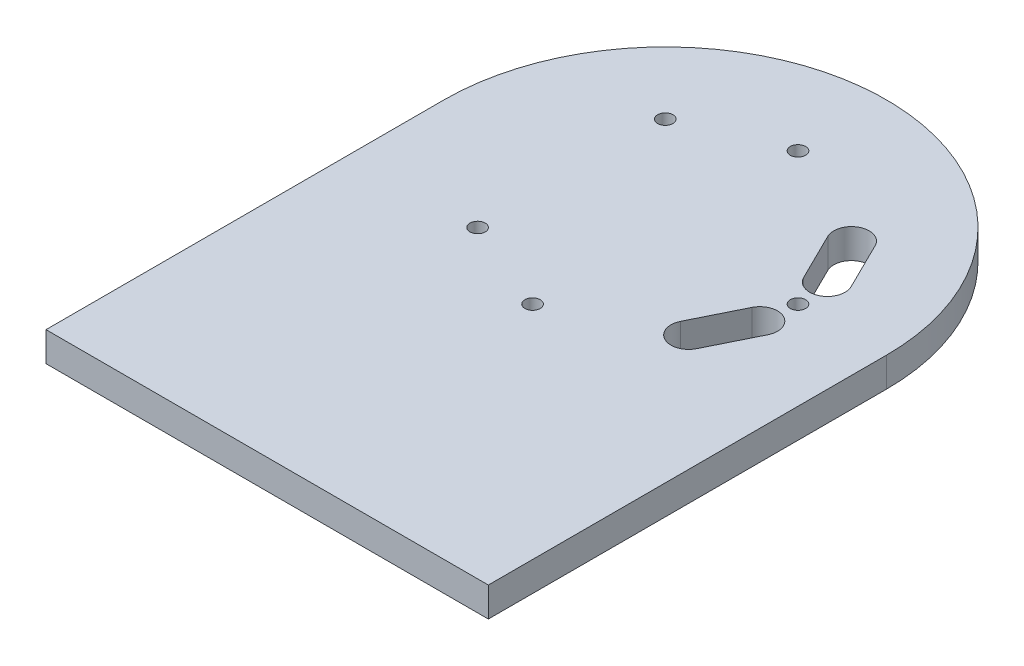
ISO-10303-21;
HEADER;
FILE_DESCRIPTION(('STEP AP214'),'2;1');
FILE_NAME('part.step','',(''),(''),'','','');
FILE_SCHEMA(('AUTOMOTIVE_DESIGN { 1 0 10303 214 1 1 1 1 }'));
ENDSEC;
DATA;
#1=APPLICATION_CONTEXT('core data for automotive mechanical design processes');
#2=APPLICATION_PROTOCOL_DEFINITION('international standard','automotive_design',2000,#1);
#3=PRODUCT_CONTEXT('',#1,'mechanical');
#4=PRODUCT('Part','Part','',(#3));
#5=PRODUCT_RELATED_PRODUCT_CATEGORY('part','',(#4));
#6=PRODUCT_DEFINITION_FORMATION('','',#4);
#7=PRODUCT_DEFINITION_CONTEXT('part definition',#1,'design');
#8=PRODUCT_DEFINITION('design','',#6,#7);
#9=PRODUCT_DEFINITION_SHAPE('','',#8);
#10=(LENGTH_UNIT() NAMED_UNIT(*) SI_UNIT(.MILLI.,.METRE.));
#11=(NAMED_UNIT(*) PLANE_ANGLE_UNIT() SI_UNIT($,.RADIAN.));
#12=(NAMED_UNIT(*) SI_UNIT($,.STERADIAN.) SOLID_ANGLE_UNIT());
#13=UNCERTAINTY_MEASURE_WITH_UNIT(LENGTH_MEASURE(1.E-05),#10,'distance_accuracy_value','');
#14=(GEOMETRIC_REPRESENTATION_CONTEXT(3) GLOBAL_UNCERTAINTY_ASSIGNED_CONTEXT((#13)) GLOBAL_UNIT_ASSIGNED_CONTEXT((#10,
#11,#12)) REPRESENTATION_CONTEXT('',''));
#15=CARTESIAN_POINT('',(0.,0.,0.));
#16=DIRECTION('',(0.,0.,1.));
#17=DIRECTION('',(1.,0.,0.));
#18=AXIS2_PLACEMENT_3D('',#15,#16,#17);
#19=CARTESIAN_POINT('',(-4.0862049089915,6.35,80.0777913457547));
#20=DIRECTION('',(0.896542211805716,0.,0.442958307801664));
#21=DIRECTION('',(0.442958307801664,0.,-0.896542211805716));
#22=AXIS2_PLACEMENT_3D('',#19,#20,#21);
#23=PLANE('',#22);
#24=DIRECTION('',(-0.442958307801664,0.,0.896542211805716));
#25=VECTOR('',#24,1.);
#26=CARTESIAN_POINT('',(-4.0862049089915,0.,80.0777913457547));
#27=LINE('',#26,#25);
#28=CARTESIAN_POINT('',(31.0484235350287,0.,8.96573194562274));
#29=VERTEX_POINT('',#28);
#30=CARTESIAN_POINT('',(25.9854100768557,0.,19.2132094265621));
#31=VERTEX_POINT('',#30);
#32=EDGE_CURVE('E186',#29,#31,#27,.T.);
#33=ORIENTED_EDGE('',*,*,#32,.T.);
#34=DIRECTION('',(0.,-1.,0.));
#35=VECTOR('',#34,1.);
#36=CARTESIAN_POINT('',(25.9854100768557,6.35,19.2132094265621));
#37=LINE('',#36,#35);
#38=CARTESIAN_POINT('',(25.9854100768557,6.35,19.2132094265621));
#39=VERTEX_POINT('',#38);
#40=EDGE_CURVE('E11',#39,#31,#37,.T.);
#41=ORIENTED_EDGE('',*,*,#40,.F.);
#42=DIRECTION('',(-0.442958307801664,0.,0.896542211805716));
#43=VECTOR('',#42,1.);
#44=CARTESIAN_POINT('',(-4.0862049089915,6.35,80.0777913457547));
#45=LINE('',#44,#43);
#46=CARTESIAN_POINT('',(31.0484235350287,6.35,8.96573194562274));
#47=VERTEX_POINT('',#46);
#48=EDGE_CURVE('E133',#47,#39,#45,.T.);
#49=ORIENTED_EDGE('',*,*,#48,.F.);
#50=DIRECTION('',(0.,-1.,0.));
#51=VECTOR('',#50,1.);
#52=CARTESIAN_POINT('',(31.0484235350287,6.35,8.96573194562274));
#53=LINE('',#52,#51);
#54=EDGE_CURVE('E194',#47,#29,#53,.T.);
#55=ORIENTED_EDGE('',*,*,#54,.T.);
#56=EDGE_LOOP('',(#33,#41,#49,#55));
#57=FACE_BOUND('',#56,.T.);
#58=ADVANCED_FACE('F31',(#57),#23,.F.);
#59=CARTESIAN_POINT('',(22.5695842498759,6.35,17.5255382738377));
#60=DIRECTION('',(0.,-1.,0.));
#61=DIRECTION('',(0.,0.,-1.));
#62=AXIS2_PLACEMENT_3D('',#59,#60,#61);
#63=CYLINDRICAL_SURFACE('',#62,3.81);
#64=CARTESIAN_POINT('',(22.5695842498759,0.,17.5255382738377));
#65=DIRECTION('',(0.,1.,0.));
#66=DIRECTION('',(0.,0.,1.));
#67=AXIS2_PLACEMENT_3D('',#64,#65,#66);
#68=CIRCLE('',#67,3.81);
#69=CARTESIAN_POINT('',(19.1537584228962,0.,15.8378671211134));
#70=VERTEX_POINT('',#69);
#71=EDGE_CURVE('E139',#31,#70,#68,.F.);
#72=ORIENTED_EDGE('',*,*,#71,.T.);
#73=DIRECTION('',(0.,-1.,0.));
#74=VECTOR('',#73,1.);
#75=CARTESIAN_POINT('',(19.1537584228962,6.35,15.8378671211134));
#76=LINE('',#75,#74);
#77=CARTESIAN_POINT('',(19.1537584228962,6.35,15.8378671211134));
#78=VERTEX_POINT('',#77);
#79=EDGE_CURVE('E41',#78,#70,#76,.T.);
#80=ORIENTED_EDGE('',*,*,#79,.F.);
#81=CARTESIAN_POINT('',(22.5695842498759,6.35,17.5255382738377));
#82=DIRECTION('',(0.,1.,0.));
#83=DIRECTION('',(0.,0.,1.));
#84=AXIS2_PLACEMENT_3D('',#81,#82,#83);
#85=CIRCLE('',#84,3.81);
#86=EDGE_CURVE('E127',#39,#78,#85,.F.);
#87=ORIENTED_EDGE('',*,*,#86,.F.);
#88=ORIENTED_EDGE('',*,*,#40,.T.);
#89=EDGE_LOOP('',(#72,#80,#87,#88));
#90=FACE_BOUND('',#89,.T.);
#91=ADVANCED_FACE('F138',(#90),#63,.F.);
#92=CARTESIAN_POINT('',(-10.9178565629511,6.35,76.7024490403061));
#93=DIRECTION('',(0.896542211805716,0.,0.442958307801665));
#94=DIRECTION('',(0.442958307801665,0.,-0.896542211805716));
#95=AXIS2_PLACEMENT_3D('',#92,#93,#94);
#96=PLANE('',#95);
#97=DIRECTION('',(-0.442958307801665,0.,0.896542211805716));
#98=VECTOR('',#97,1.);
#99=CARTESIAN_POINT('',(-10.9178565629511,0.,76.7024490403061));
#100=LINE('',#99,#98);
#101=CARTESIAN_POINT('',(24.2167718810692,0.,5.59038964017405));
#102=VERTEX_POINT('',#101);
#103=EDGE_CURVE('E190',#102,#70,#100,.T.);
#104=ORIENTED_EDGE('',*,*,#103,.F.);
#105=DIRECTION('',(0.,-1.,0.));
#106=VECTOR('',#105,1.);
#107=CARTESIAN_POINT('',(24.2167718810692,6.35,5.59038964017405));
#108=LINE('',#107,#106);
#109=CARTESIAN_POINT('',(24.2167718810692,6.35,5.59038964017405));
#110=VERTEX_POINT('',#109);
#111=EDGE_CURVE('E90',#110,#102,#108,.T.);
#112=ORIENTED_EDGE('',*,*,#111,.F.);
#113=DIRECTION('',(-0.442958307801665,0.,0.896542211805716));
#114=VECTOR('',#113,1.);
#115=CARTESIAN_POINT('',(-10.9178565629511,6.35,76.7024490403061));
#116=LINE('',#115,#114);
#117=EDGE_CURVE('E131',#110,#78,#116,.T.);
#118=ORIENTED_EDGE('',*,*,#117,.T.);
#119=ORIENTED_EDGE('',*,*,#79,.T.);
#120=EDGE_LOOP('',(#104,#112,#118,#119));
#121=FACE_BOUND('',#120,.T.);
#122=ADVANCED_FACE('F144',(#121),#96,.T.);
#123=CARTESIAN_POINT('',(22.569584249876,6.35,-17.5255382738377));
#124=DIRECTION('',(0.,-1.,0.));
#125=DIRECTION('',(0.,0.,-1.));
#126=AXIS2_PLACEMENT_3D('',#123,#124,#125);
#127=CYLINDRICAL_SURFACE('',#126,3.81);
#128=CARTESIAN_POINT('',(22.569584249876,0.,-17.5255382738377));
#129=DIRECTION('',(0.,1.,0.));
#130=DIRECTION('',(0.,0.,1.));
#131=AXIS2_PLACEMENT_3D('',#128,#129,#130);
#132=CIRCLE('',#131,3.81);
#133=CARTESIAN_POINT('',(25.9854100768557,0.,-19.2132094265621));
#134=VERTEX_POINT('',#133);
#135=CARTESIAN_POINT('',(19.1537584228962,0.,-15.8378671211134));
#136=VERTEX_POINT('',#135);
#137=EDGE_CURVE('E174',#134,#136,#132,.T.);
#138=ORIENTED_EDGE('',*,*,#137,.F.);
#139=DIRECTION('',(0.,-1.,0.));
#140=VECTOR('',#139,1.);
#141=CARTESIAN_POINT('',(25.9854100768557,6.35,-19.2132094265621));
#142=LINE('',#141,#140);
#143=CARTESIAN_POINT('',(25.9854100768557,6.35,-19.2132094265621));
#144=VERTEX_POINT('',#143);
#145=EDGE_CURVE('E196',#144,#134,#142,.T.);
#146=ORIENTED_EDGE('',*,*,#145,.F.);
#147=CARTESIAN_POINT('',(22.569584249876,6.35,-17.5255382738377));
#148=DIRECTION('',(0.,1.,0.));
#149=DIRECTION('',(0.,0.,1.));
#150=AXIS2_PLACEMENT_3D('',#147,#148,#149);
#151=CIRCLE('',#150,3.81);
#152=CARTESIAN_POINT('',(19.1537584228962,6.35,-15.8378671211134));
#153=VERTEX_POINT('',#152);
#154=EDGE_CURVE('E251',#144,#153,#151,.T.);
#155=ORIENTED_EDGE('',*,*,#154,.T.);
#156=DIRECTION('',(0.,-1.,0.));
#157=VECTOR('',#156,1.);
#158=CARTESIAN_POINT('',(19.1537584228962,6.35,-15.8378671211134));
#159=LINE('',#158,#157);
#160=EDGE_CURVE('E198',#153,#136,#159,.T.);
#161=ORIENTED_EDGE('',*,*,#160,.T.);
#162=EDGE_LOOP('',(#138,#146,#155,#161));
#163=FACE_BOUND('',#162,.T.);
#164=ADVANCED_FACE('F272',(#163),#127,.F.);
#165=CARTESIAN_POINT('',(11.0444793716504,6.35,-49.4534709251194));
#166=DIRECTION('',(-0.896542211805716,0.,0.442958307801664));
#167=DIRECTION('',(0.442958307801664,0.,0.896542211805716));
#168=AXIS2_PLACEMENT_3D('',#165,#166,#167);
#169=PLANE('',#168);
#170=DIRECTION('',(-0.442958307801664,0.,-0.896542211805716));
#171=VECTOR('',#170,1.);
#172=CARTESIAN_POINT('',(11.0444793716504,0.,-49.4534709251194));
#173=LINE('',#172,#171);
#174=CARTESIAN_POINT('',(31.0484235350288,0.,-8.96573194562273));
#175=VERTEX_POINT('',#174);
#176=EDGE_CURVE('E177',#175,#134,#173,.T.);
#177=ORIENTED_EDGE('',*,*,#176,.F.);
#178=DIRECTION('',(0.,-1.,0.));
#179=VECTOR('',#178,1.);
#180=CARTESIAN_POINT('',(31.0484235350288,6.35,-8.96573194562273));
#181=LINE('',#180,#179);
#182=CARTESIAN_POINT('',(31.0484235350288,6.35,-8.96573194562273));
#183=VERTEX_POINT('',#182);
#184=EDGE_CURVE('E202',#183,#175,#181,.T.);
#185=ORIENTED_EDGE('',*,*,#184,.F.);
#186=DIRECTION('',(-0.442958307801664,0.,-0.896542211805716));
#187=VECTOR('',#186,1.);
#188=CARTESIAN_POINT('',(11.0444793716504,6.35,-49.4534709251194));
#189=LINE('',#188,#187);
#190=EDGE_CURVE('E254',#183,#144,#189,.T.);
#191=ORIENTED_EDGE('',*,*,#190,.T.);
#192=ORIENTED_EDGE('',*,*,#145,.T.);
#193=EDGE_LOOP('',(#177,#185,#191,#192));
#194=FACE_BOUND('',#193,.T.);
#195=ADVANCED_FACE('F275',(#194),#169,.T.);
#196=CARTESIAN_POINT('',(27.632597708049,6.35,-7.27806079289839));
#197=DIRECTION('',(0.,-1.,0.));
#198=DIRECTION('',(0.,0.,-1.));
#199=AXIS2_PLACEMENT_3D('',#196,#197,#198);
#200=CYLINDRICAL_SURFACE('',#199,3.81);
#201=CARTESIAN_POINT('',(27.632597708049,0.,-7.27806079289839));
#202=DIRECTION('',(0.,1.,0.));
#203=DIRECTION('',(0.,0.,1.));
#204=AXIS2_PLACEMENT_3D('',#201,#202,#203);
#205=CIRCLE('',#204,3.81);
#206=CARTESIAN_POINT('',(24.2167718810693,0.,-5.59038964017405));
#207=VERTEX_POINT('',#206);
#208=EDGE_CURVE('E180',#207,#175,#205,.T.);
#209=ORIENTED_EDGE('',*,*,#208,.F.);
#210=DIRECTION('',(0.,-1.,0.));
#211=VECTOR('',#210,1.);
#212=CARTESIAN_POINT('',(24.2167718810693,6.35,-5.59038964017405));
#213=LINE('',#212,#211);
#214=CARTESIAN_POINT('',(24.2167718810693,6.35,-5.59038964017405));
#215=VERTEX_POINT('',#214);
#216=EDGE_CURVE('E200',#215,#207,#213,.T.);
#217=ORIENTED_EDGE('',*,*,#216,.F.);
#218=CARTESIAN_POINT('',(27.632597708049,6.35,-7.27806079289839));
#219=DIRECTION('',(0.,1.,0.));
#220=DIRECTION('',(0.,0.,1.));
#221=AXIS2_PLACEMENT_3D('',#218,#219,#220);
#222=CIRCLE('',#221,3.81);
#223=EDGE_CURVE('E257',#215,#183,#222,.T.);
#224=ORIENTED_EDGE('',*,*,#223,.T.);
#225=ORIENTED_EDGE('',*,*,#184,.T.);
#226=EDGE_LOOP('',(#209,#217,#224,#225));
#227=FACE_BOUND('',#226,.T.);
#228=ADVANCED_FACE('F278',(#227),#200,.F.);
#229=CARTESIAN_POINT('',(-47.625,6.35,19.05));
#230=DIRECTION('',(1.,0.,0.));
#231=DIRECTION('',(0.,0.,-1.));
#232=AXIS2_PLACEMENT_3D('',#229,#230,#231);
#233=PLANE('',#232);
#234=DIRECTION('',(0.,0.,1.));
#235=VECTOR('',#234,1.);
#236=CARTESIAN_POINT('',(-47.625,0.,19.05));
#237=LINE('',#236,#235);
#238=CARTESIAN_POINT('',(-47.625,0.,0.));
#239=VERTEX_POINT('',#238);
#240=CARTESIAN_POINT('',(-47.625,0.,85.725));
#241=VERTEX_POINT('',#240);
#242=EDGE_CURVE('E150',#239,#241,#237,.T.);
#243=ORIENTED_EDGE('',*,*,#242,.T.);
#244=DIRECTION('',(0.,-1.,0.));
#245=VECTOR('',#244,1.);
#246=CARTESIAN_POINT('',(-47.625,6.35,85.725));
#247=LINE('',#246,#245);
#248=CARTESIAN_POINT('',(-47.625,6.35,85.725));
#249=VERTEX_POINT('',#248);
#250=EDGE_CURVE('E35',#249,#241,#247,.T.);
#251=ORIENTED_EDGE('',*,*,#250,.F.);
#252=DIRECTION('',(0.,0.,1.));
#253=VECTOR('',#252,1.);
#254=CARTESIAN_POINT('',(-47.625,6.35,19.05));
#255=LINE('',#254,#253);
#256=CARTESIAN_POINT('',(-47.625,6.35,0.));
#257=VERTEX_POINT('',#256);
#258=EDGE_CURVE('E193',#257,#249,#255,.T.);
#259=ORIENTED_EDGE('',*,*,#258,.F.);
#260=DIRECTION('',(0.,-1.,0.));
#261=VECTOR('',#260,1.);
#262=CARTESIAN_POINT('',(-47.625,6.35,0.));
#263=LINE('',#262,#261);
#264=EDGE_CURVE('E146',#257,#239,#263,.T.);
#265=ORIENTED_EDGE('',*,*,#264,.T.);
#266=EDGE_LOOP('',(#243,#251,#259,#265));
#267=FACE_BOUND('',#266,.T.);
#268=ADVANCED_FACE('F33',(#267),#233,.F.);
#269=CARTESIAN_POINT('',(-127.605710178636,6.35,85.725));
#270=DIRECTION('',(0.,0.,-1.));
#271=DIRECTION('',(-1.,0.,0.));
#272=AXIS2_PLACEMENT_3D('',#269,#270,#271);
#273=PLANE('',#272);
#274=DIRECTION('',(1.,0.,0.));
#275=VECTOR('',#274,1.);
#276=CARTESIAN_POINT('',(-127.605710178636,0.,85.725));
#277=LINE('',#276,#275);
#278=CARTESIAN_POINT('',(47.625,0.,85.725));
#279=VERTEX_POINT('',#278);
#280=EDGE_CURVE('E153',#241,#279,#277,.T.);
#281=ORIENTED_EDGE('',*,*,#280,.T.);
#282=DIRECTION('',(0.,-1.,0.));
#283=VECTOR('',#282,1.);
#284=CARTESIAN_POINT('',(47.625,6.35,85.725));
#285=LINE('',#284,#283);
#286=CARTESIAN_POINT('',(47.625,6.35,85.725));
#287=VERTEX_POINT('',#286);
#288=EDGE_CURVE('E209',#287,#279,#285,.T.);
#289=ORIENTED_EDGE('',*,*,#288,.F.);
#290=DIRECTION('',(1.,0.,0.));
#291=VECTOR('',#290,1.);
#292=CARTESIAN_POINT('',(-127.605710178636,6.35,85.725));
#293=LINE('',#292,#291);
#294=EDGE_CURVE('E102',#249,#287,#293,.T.);
#295=ORIENTED_EDGE('',*,*,#294,.F.);
#296=ORIENTED_EDGE('',*,*,#250,.T.);
#297=EDGE_LOOP('',(#281,#289,#295,#296));
#298=FACE_BOUND('',#297,.T.);
#299=ADVANCED_FACE('F215',(#298),#273,.F.);
#300=CARTESIAN_POINT('',(47.625,6.35,19.05));
#301=DIRECTION('',(-1.,0.,0.));
#302=DIRECTION('',(0.,0.,1.));
#303=AXIS2_PLACEMENT_3D('',#300,#301,#302);
#304=PLANE('',#303);
#305=DIRECTION('',(0.,0.,-1.));
#306=VECTOR('',#305,1.);
#307=CARTESIAN_POINT('',(47.625,0.,19.05));
#308=LINE('',#307,#306);
#309=CARTESIAN_POINT('',(47.625,0.,0.));
#310=VERTEX_POINT('',#309);
#311=EDGE_CURVE('E155',#279,#310,#308,.T.);
#312=ORIENTED_EDGE('',*,*,#311,.T.);
#313=DIRECTION('',(0.,-1.,0.));
#314=VECTOR('',#313,1.);
#315=CARTESIAN_POINT('',(47.625,6.35,0.));
#316=LINE('',#315,#314);
#317=CARTESIAN_POINT('',(47.625,6.35,0.));
#318=VERTEX_POINT('',#317);
#319=EDGE_CURVE('E207',#318,#310,#316,.T.);
#320=ORIENTED_EDGE('',*,*,#319,.F.);
#321=DIRECTION('',(0.,0.,-1.));
#322=VECTOR('',#321,1.);
#323=CARTESIAN_POINT('',(47.625,6.35,19.05));
#324=LINE('',#323,#322);
#325=EDGE_CURVE('E232',#287,#318,#324,.T.);
#326=ORIENTED_EDGE('',*,*,#325,.F.);
#327=ORIENTED_EDGE('',*,*,#288,.T.);
#328=EDGE_LOOP('',(#312,#320,#326,#327));
#329=FACE_BOUND('',#328,.T.);
#330=ADVANCED_FACE('F225',(#329),#304,.F.);
#331=CARTESIAN_POINT('',(4.21282771769083,6.35,-46.0781286196707));
#332=DIRECTION('',(-0.896542211805716,0.,0.442958307801665));
#333=DIRECTION('',(0.442958307801665,0.,0.896542211805716));
#334=AXIS2_PLACEMENT_3D('',#331,#332,#333);
#335=PLANE('',#334);
#336=DIRECTION('',(-0.442958307801665,0.,-0.896542211805716));
#337=VECTOR('',#336,1.);
#338=CARTESIAN_POINT('',(4.21282771769083,0.,-46.0781286196707));
#339=LINE('',#338,#337);
#340=EDGE_CURVE('E183',#207,#136,#339,.T.);
#341=ORIENTED_EDGE('',*,*,#340,.T.);
#342=ORIENTED_EDGE('',*,*,#160,.F.);
#343=DIRECTION('',(-0.442958307801665,0.,-0.896542211805716));
#344=VECTOR('',#343,1.);
#345=CARTESIAN_POINT('',(4.21282771769083,6.35,-46.0781286196707));
#346=LINE('',#345,#344);
#347=EDGE_CURVE('E260',#215,#153,#346,.T.);
#348=ORIENTED_EDGE('',*,*,#347,.F.);
#349=ORIENTED_EDGE('',*,*,#216,.T.);
#350=EDGE_LOOP('',(#341,#342,#348,#349));
#351=FACE_BOUND('',#350,.T.);
#352=ADVANCED_FACE('F268',(#351),#335,.F.);
#353=CARTESIAN_POINT('',(-20.2055762724057,6.35,20.2055762724055));
#354=DIRECTION('',(0.,-1.,0.));
#355=DIRECTION('',(0.,0.,-1.));
#356=AXIS2_PLACEMENT_3D('',#353,#354,#355);
#357=CYLINDRICAL_SURFACE('',#356,1.651);
#358=CARTESIAN_POINT('',(-20.2055762724057,6.35,20.2055762724055));
#359=DIRECTION('',(0.,1.,0.));
#360=DIRECTION('',(0.,0.,1.));
#361=AXIS2_PLACEMENT_3D('',#358,#359,#360);
#362=CIRCLE('',#361,1.651);
#363=CARTESIAN_POINT('',(-20.2055762724057,6.35,21.8565762724055));
#364=VERTEX_POINT('',#363);
#365=EDGE_CURVE('E248',#364,#364,#362,.T.);
#366=ORIENTED_EDGE('',*,*,#365,.T.);
#367=EDGE_LOOP('',(#366));
#368=FACE_BOUND('',#367,.T.);
#369=CARTESIAN_POINT('',(-20.2055762724057,0.,20.2055762724055));
#370=DIRECTION('',(0.,1.,0.));
#371=DIRECTION('',(0.,0.,1.));
#372=AXIS2_PLACEMENT_3D('',#369,#370,#371);
#373=CIRCLE('',#372,1.651);
#374=CARTESIAN_POINT('',(-20.2055762724057,0.,21.8565762724055));
#375=VERTEX_POINT('',#374);
#376=EDGE_CURVE('E171',#375,#375,#373,.T.);
#377=ORIENTED_EDGE('',*,*,#376,.F.);
#378=EDGE_LOOP('',(#377));
#379=FACE_BOUND('',#378,.T.);
#380=ADVANCED_FACE('F305',(#368,#379),#357,.F.);
#381=CARTESIAN_POINT('',(-20.2055762724057,6.35,-20.2055762724055));
#382=DIRECTION('',(0.,-1.,0.));
#383=DIRECTION('',(0.,0.,-1.));
#384=AXIS2_PLACEMENT_3D('',#381,#382,#383);
#385=CYLINDRICAL_SURFACE('',#384,1.651);
#386=CARTESIAN_POINT('',(-20.2055762724057,6.35,-20.2055762724055));
#387=DIRECTION('',(0.,1.,0.));
#388=DIRECTION('',(0.,0.,1.));
#389=AXIS2_PLACEMENT_3D('',#386,#387,#388);
#390=CIRCLE('',#389,1.651);
#391=CARTESIAN_POINT('',(-20.2055762724057,6.35,-18.5545762724055));
#392=VERTEX_POINT('',#391);
#393=EDGE_CURVE('E245',#392,#392,#390,.T.);
#394=ORIENTED_EDGE('',*,*,#393,.T.);
#395=EDGE_LOOP('',(#394));
#396=FACE_BOUND('',#395,.T.);
#397=CARTESIAN_POINT('',(-20.2055762724057,0.,-20.2055762724055));
#398=DIRECTION('',(0.,1.,0.));
#399=DIRECTION('',(0.,0.,1.));
#400=AXIS2_PLACEMENT_3D('',#397,#398,#399);
#401=CIRCLE('',#400,1.651);
#402=CARTESIAN_POINT('',(-20.2055762724057,0.,-18.5545762724055));
#403=VERTEX_POINT('',#402);
#404=EDGE_CURVE('E168',#403,#403,#401,.T.);
#405=ORIENTED_EDGE('',*,*,#404,.F.);
#406=EDGE_LOOP('',(#405));
#407=FACE_BOUND('',#406,.T.);
#408=ADVANCED_FACE('F314',(#396,#407),#385,.F.);
#409=CARTESIAN_POINT('',(28.575,6.35,0.));
#410=DIRECTION('',(0.,-1.,0.));
#411=DIRECTION('',(0.,0.,-1.));
#412=AXIS2_PLACEMENT_3D('',#409,#410,#411);
#413=CYLINDRICAL_SURFACE('',#412,1.651);
#414=CARTESIAN_POINT('',(28.575,6.35,0.));
#415=DIRECTION('',(0.,1.,0.));
#416=DIRECTION('',(0.,0.,1.));
#417=AXIS2_PLACEMENT_3D('',#414,#415,#416);
#418=CIRCLE('',#417,1.651);
#419=CARTESIAN_POINT('',(28.575,6.35,1.651));
#420=VERTEX_POINT('',#419);
#421=EDGE_CURVE('E242',#420,#420,#418,.T.);
#422=ORIENTED_EDGE('',*,*,#421,.T.);
#423=EDGE_LOOP('',(#422));
#424=FACE_BOUND('',#423,.T.);
#425=CARTESIAN_POINT('',(28.575,0.,0.));
#426=DIRECTION('',(0.,1.,0.));
#427=DIRECTION('',(0.,0.,1.));
#428=AXIS2_PLACEMENT_3D('',#425,#426,#427);
#429=CIRCLE('',#428,1.651);
#430=CARTESIAN_POINT('',(28.575,0.,1.651));
#431=VERTEX_POINT('',#430);
#432=EDGE_CURVE('E165',#431,#431,#429,.T.);
#433=ORIENTED_EDGE('',*,*,#432,.F.);
#434=EDGE_LOOP('',(#433));
#435=FACE_BOUND('',#434,.T.);
#436=ADVANCED_FACE('F318',(#424,#435),#413,.F.);
#437=CARTESIAN_POINT('',(0.,6.35,28.575));
#438=DIRECTION('',(0.,-1.,0.));
#439=DIRECTION('',(0.,0.,-1.));
#440=AXIS2_PLACEMENT_3D('',#437,#438,#439);
#441=CYLINDRICAL_SURFACE('',#440,1.651);
#442=CARTESIAN_POINT('',(0.,6.35,28.575));
#443=DIRECTION('',(0.,1.,0.));
#444=DIRECTION('',(0.,0.,1.));
#445=AXIS2_PLACEMENT_3D('',#442,#443,#444);
#446=CIRCLE('',#445,1.651);
#447=CARTESIAN_POINT('',(0.,6.35,30.226));
#448=VERTEX_POINT('',#447);
#449=EDGE_CURVE('E235',#448,#448,#446,.T.);
#450=ORIENTED_EDGE('',*,*,#449,.T.);
#451=EDGE_LOOP('',(#450));
#452=FACE_BOUND('',#451,.T.);
#453=CARTESIAN_POINT('',(0.,0.,28.575));
#454=DIRECTION('',(0.,1.,0.));
#455=DIRECTION('',(0.,0.,1.));
#456=AXIS2_PLACEMENT_3D('',#453,#454,#455);
#457=CIRCLE('',#456,1.651);
#458=CARTESIAN_POINT('',(0.,0.,30.226));
#459=VERTEX_POINT('',#458);
#460=EDGE_CURVE('E162',#459,#459,#457,.T.);
#461=ORIENTED_EDGE('',*,*,#460,.F.);
#462=EDGE_LOOP('',(#461));
#463=FACE_BOUND('',#462,.T.);
#464=ADVANCED_FACE('F322',(#452,#463),#441,.F.);
#465=CARTESIAN_POINT('',(0.,6.35,-28.575));
#466=DIRECTION('',(0.,-1.,0.));
#467=DIRECTION('',(0.,0.,-1.));
#468=AXIS2_PLACEMENT_3D('',#465,#466,#467);
#469=CYLINDRICAL_SURFACE('',#468,1.651);
#470=CARTESIAN_POINT('',(0.,6.35,-28.575));
#471=DIRECTION('',(0.,1.,0.));
#472=DIRECTION('',(0.,0.,1.));
#473=AXIS2_PLACEMENT_3D('',#470,#471,#472);
#474=CIRCLE('',#473,1.651);
#475=CARTESIAN_POINT('',(0.,6.35,-26.924));
#476=VERTEX_POINT('',#475);
#477=EDGE_CURVE('E231',#476,#476,#474,.T.);
#478=ORIENTED_EDGE('',*,*,#477,.T.);
#479=EDGE_LOOP('',(#478));
#480=FACE_BOUND('',#479,.T.);
#481=CARTESIAN_POINT('',(0.,0.,-28.575));
#482=DIRECTION('',(0.,1.,0.));
#483=DIRECTION('',(0.,0.,1.));
#484=AXIS2_PLACEMENT_3D('',#481,#482,#483);
#485=CIRCLE('',#484,1.651);
#486=CARTESIAN_POINT('',(0.,0.,-26.924));
#487=VERTEX_POINT('',#486);
#488=EDGE_CURVE('E159',#487,#487,#485,.T.);
#489=ORIENTED_EDGE('',*,*,#488,.F.);
#490=EDGE_LOOP('',(#489));
#491=FACE_BOUND('',#490,.T.);
#492=ADVANCED_FACE('F293',(#480,#491),#469,.F.);
#493=CARTESIAN_POINT('',(0.,6.35,0.));
#494=DIRECTION('',(0.,-1.,0.));
#495=DIRECTION('',(0.,0.,-1.));
#496=AXIS2_PLACEMENT_3D('',#493,#494,#495);
#497=CYLINDRICAL_SURFACE('',#496,47.625);
#498=CARTESIAN_POINT('',(0.,0.,0.));
#499=DIRECTION('',(0.,1.,0.));
#500=DIRECTION('',(0.,0.,1.));
#501=AXIS2_PLACEMENT_3D('',#498,#499,#500);
#502=CIRCLE('',#501,47.625);
#503=EDGE_CURVE('E157',#310,#239,#502,.T.);
#504=ORIENTED_EDGE('',*,*,#503,.T.);
#505=ORIENTED_EDGE('',*,*,#264,.F.);
#506=CARTESIAN_POINT('',(0.,6.35,0.));
#507=DIRECTION('',(0.,1.,0.));
#508=DIRECTION('',(0.,0.,1.));
#509=AXIS2_PLACEMENT_3D('',#506,#507,#508);
#510=CIRCLE('',#509,47.625);
#511=EDGE_CURVE('E229',#318,#257,#510,.T.);
#512=ORIENTED_EDGE('',*,*,#511,.F.);
#513=ORIENTED_EDGE('',*,*,#319,.T.);
#514=EDGE_LOOP('',(#504,#505,#512,#513));
#515=FACE_BOUND('',#514,.T.);
#516=ADVANCED_FACE('F228',(#515),#497,.T.);
#517=CARTESIAN_POINT('',(27.632597708049,6.35,7.27806079289839));
#518=DIRECTION('',(0.,-1.,0.));
#519=DIRECTION('',(0.,0.,-1.));
#520=AXIS2_PLACEMENT_3D('',#517,#518,#519);
#521=CYLINDRICAL_SURFACE('',#520,3.81);
#522=CARTESIAN_POINT('',(27.632597708049,0.,7.27806079289839));
#523=DIRECTION('',(0.,1.,0.));
#524=DIRECTION('',(0.,0.,1.));
#525=AXIS2_PLACEMENT_3D('',#522,#523,#524);
#526=CIRCLE('',#525,3.81);
#527=EDGE_CURVE('E93',#102,#29,#526,.F.);
#528=ORIENTED_EDGE('',*,*,#527,.T.);
#529=ORIENTED_EDGE('',*,*,#54,.F.);
#530=CARTESIAN_POINT('',(27.632597708049,6.35,7.27806079289839));
#531=DIRECTION('',(0.,1.,0.));
#532=DIRECTION('',(0.,0.,1.));
#533=AXIS2_PLACEMENT_3D('',#530,#531,#532);
#534=CIRCLE('',#533,3.81);
#535=EDGE_CURVE('E50',#110,#47,#534,.F.);
#536=ORIENTED_EDGE('',*,*,#535,.F.);
#537=ORIENTED_EDGE('',*,*,#111,.T.);
#538=EDGE_LOOP('',(#528,#529,#536,#537));
#539=FACE_BOUND('',#538,.T.);
#540=ADVANCED_FACE('F285',(#539),#521,.F.);
#541=CARTESIAN_POINT('',(-127.605710178636,6.35,19.05));
#542=DIRECTION('',(0.,1.,0.));
#543=DIRECTION('',(0.,0.,1.));
#544=AXIS2_PLACEMENT_3D('',#541,#542,#543);
#545=PLANE('',#544);
#546=ORIENTED_EDGE('',*,*,#258,.T.);
#547=ORIENTED_EDGE('',*,*,#294,.T.);
#548=ORIENTED_EDGE('',*,*,#325,.T.);
#549=ORIENTED_EDGE('',*,*,#511,.T.);
#550=EDGE_LOOP('',(#546,#547,#548,#549));
#551=FACE_BOUND('',#550,.T.);
#552=ORIENTED_EDGE('',*,*,#477,.F.);
#553=EDGE_LOOP('',(#552));
#554=FACE_BOUND('',#553,.T.);
#555=ORIENTED_EDGE('',*,*,#449,.F.);
#556=EDGE_LOOP('',(#555));
#557=FACE_BOUND('',#556,.T.);
#558=ORIENTED_EDGE('',*,*,#421,.F.);
#559=EDGE_LOOP('',(#558));
#560=FACE_BOUND('',#559,.T.);
#561=ORIENTED_EDGE('',*,*,#393,.F.);
#562=EDGE_LOOP('',(#561));
#563=FACE_BOUND('',#562,.T.);
#564=ORIENTED_EDGE('',*,*,#365,.F.);
#565=EDGE_LOOP('',(#564));
#566=FACE_BOUND('',#565,.T.);
#567=ORIENTED_EDGE('',*,*,#154,.F.);
#568=ORIENTED_EDGE('',*,*,#190,.F.);
#569=ORIENTED_EDGE('',*,*,#223,.F.);
#570=ORIENTED_EDGE('',*,*,#347,.T.);
#571=EDGE_LOOP('',(#567,#568,#569,#570));
#572=FACE_BOUND('',#571,.T.);
#573=ORIENTED_EDGE('',*,*,#48,.T.);
#574=ORIENTED_EDGE('',*,*,#86,.T.);
#575=ORIENTED_EDGE('',*,*,#117,.F.);
#576=ORIENTED_EDGE('',*,*,#535,.T.);
#577=EDGE_LOOP('',(#573,#574,#575,#576));
#578=FACE_BOUND('',#577,.T.);
#579=ADVANCED_FACE('F129',(#551,#554,#557,#560,#563,#566,#572,#578),#545,.T.);
#580=CARTESIAN_POINT('',(-127.605710178636,0.,19.05));
#581=DIRECTION('',(0.,1.,0.));
#582=DIRECTION('',(0.,0.,1.));
#583=AXIS2_PLACEMENT_3D('',#580,#581,#582);
#584=PLANE('',#583);
#585=ORIENTED_EDGE('',*,*,#242,.F.);
#586=ORIENTED_EDGE('',*,*,#503,.F.);
#587=ORIENTED_EDGE('',*,*,#311,.F.);
#588=ORIENTED_EDGE('',*,*,#280,.F.);
#589=EDGE_LOOP('',(#585,#586,#587,#588));
#590=FACE_BOUND('',#589,.T.);
#591=ORIENTED_EDGE('',*,*,#488,.T.);
#592=EDGE_LOOP('',(#591));
#593=FACE_BOUND('',#592,.T.);
#594=ORIENTED_EDGE('',*,*,#460,.T.);
#595=EDGE_LOOP('',(#594));
#596=FACE_BOUND('',#595,.T.);
#597=ORIENTED_EDGE('',*,*,#432,.T.);
#598=EDGE_LOOP('',(#597));
#599=FACE_BOUND('',#598,.T.);
#600=ORIENTED_EDGE('',*,*,#404,.T.);
#601=EDGE_LOOP('',(#600));
#602=FACE_BOUND('',#601,.T.);
#603=ORIENTED_EDGE('',*,*,#376,.T.);
#604=EDGE_LOOP('',(#603));
#605=FACE_BOUND('',#604,.T.);
#606=ORIENTED_EDGE('',*,*,#137,.T.);
#607=ORIENTED_EDGE('',*,*,#340,.F.);
#608=ORIENTED_EDGE('',*,*,#208,.T.);
#609=ORIENTED_EDGE('',*,*,#176,.T.);
#610=EDGE_LOOP('',(#606,#607,#608,#609));
#611=FACE_BOUND('',#610,.T.);
#612=ORIENTED_EDGE('',*,*,#32,.F.);
#613=ORIENTED_EDGE('',*,*,#527,.F.);
#614=ORIENTED_EDGE('',*,*,#103,.T.);
#615=ORIENTED_EDGE('',*,*,#71,.F.);
#616=EDGE_LOOP('',(#612,#613,#614,#615));
#617=FACE_BOUND('',#616,.T.);
#618=ADVANCED_FACE('F222',(#590,#593,#596,#599,#602,#605,#611,#617),#584,.F.);
#619=CLOSED_SHELL('',(#58,#91,#122,#164,#195,#228,#268,#299,#330,#352,#380,#408,#436,#464,#492,
#516,#540,#579,#618));
#620=MANIFOLD_SOLID_BREP('B2',#619);
#621=ADVANCED_BREP_SHAPE_REPRESENTATION('',(#18,#620),#14);
#622=SHAPE_DEFINITION_REPRESENTATION(#9,#621);
ENDSEC;
END-ISO-10303-21;
